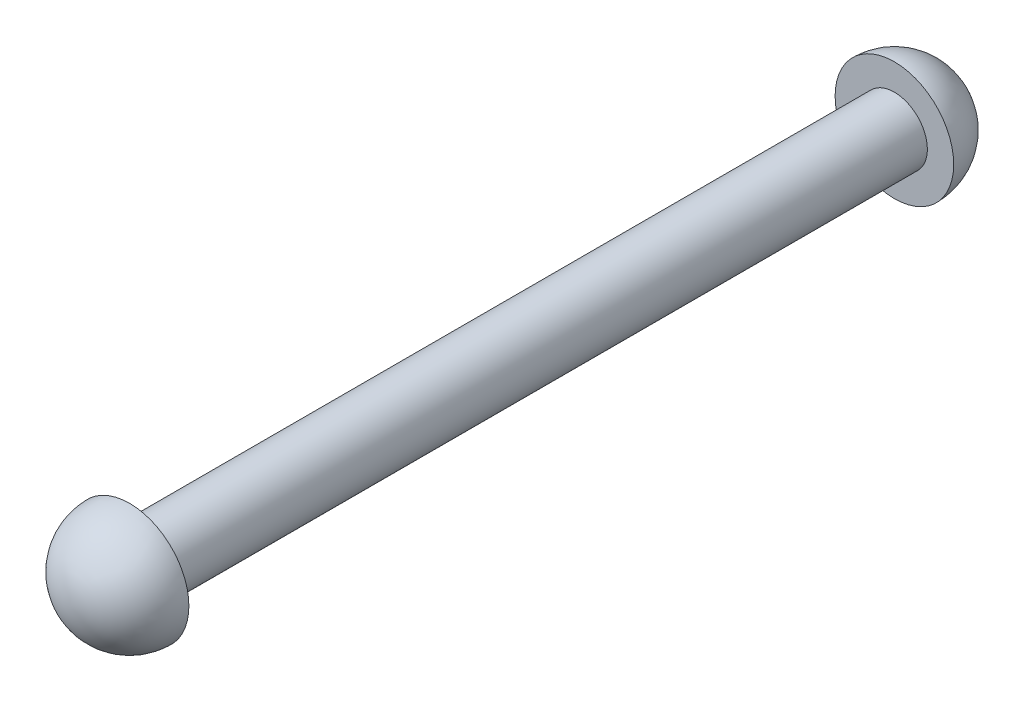
ISO-10303-21;
HEADER;
FILE_DESCRIPTION(('STEP AP214'),'2;1');
FILE_NAME('part.step','',(''),(''),'','','');
FILE_SCHEMA(('AUTOMOTIVE_DESIGN { 1 0 10303 214 1 1 1 1 }'));
ENDSEC;
DATA;
#1=APPLICATION_CONTEXT('core data for automotive mechanical design processes');
#2=APPLICATION_PROTOCOL_DEFINITION('international standard','automotive_design',2000,#1);
#3=PRODUCT_CONTEXT('',#1,'mechanical');
#4=PRODUCT('Part','Part','',(#3));
#5=PRODUCT_RELATED_PRODUCT_CATEGORY('part','',(#4));
#6=PRODUCT_DEFINITION_FORMATION('','',#4);
#7=PRODUCT_DEFINITION_CONTEXT('part definition',#1,'design');
#8=PRODUCT_DEFINITION('design','',#6,#7);
#9=PRODUCT_DEFINITION_SHAPE('','',#8);
#10=(LENGTH_UNIT() NAMED_UNIT(*) SI_UNIT(.MILLI.,.METRE.));
#11=(NAMED_UNIT(*) PLANE_ANGLE_UNIT() SI_UNIT($,.RADIAN.));
#12=(NAMED_UNIT(*) SI_UNIT($,.STERADIAN.) SOLID_ANGLE_UNIT());
#13=UNCERTAINTY_MEASURE_WITH_UNIT(LENGTH_MEASURE(1.E-05),#10,'distance_accuracy_value','');
#14=(GEOMETRIC_REPRESENTATION_CONTEXT(3) GLOBAL_UNCERTAINTY_ASSIGNED_CONTEXT((#13)) GLOBAL_UNIT_ASSIGNED_CONTEXT((#10,
#11,#12)) REPRESENTATION_CONTEXT('',''));
#15=CARTESIAN_POINT('',(0.,0.,0.));
#16=DIRECTION('',(0.,0.,1.));
#17=DIRECTION('',(1.,0.,0.));
#18=AXIS2_PLACEMENT_3D('',#15,#16,#17);
#19=CARTESIAN_POINT('',(0.,0.,39.6060392487021));
#20=DIRECTION('',(0.,0.,1.));
#21=DIRECTION('',(0.,-1.,0.));
#22=AXIS2_PLACEMENT_3D('',#19,#20,#21);
#23=CYLINDRICAL_SURFACE('',#22,2.95603448275862);
#24=CARTESIAN_POINT('',(0.,0.,-34.29));
#25=DIRECTION('',(0.,0.,1.));
#26=DIRECTION('',(0.,-1.,0.));
#27=AXIS2_PLACEMENT_3D('',#24,#25,#26);
#28=CIRCLE('',#27,2.95603448275862);
#29=CARTESIAN_POINT('',(0.,-2.95603448275862,-34.29));
#30=VERTEX_POINT('',#29);
#31=EDGE_CURVE('E62',#30,#30,#28,.T.);
#32=ORIENTED_EDGE('',*,*,#31,.T.);
#33=EDGE_LOOP('',(#32));
#34=FACE_BOUND('',#33,.T.);
#35=CARTESIAN_POINT('',(0.,0.,34.29));
#36=DIRECTION('',(0.,0.,1.));
#37=DIRECTION('',(0.,-1.,0.));
#38=AXIS2_PLACEMENT_3D('',#35,#36,#37);
#39=CIRCLE('',#38,2.95603448275862);
#40=CARTESIAN_POINT('',(0.,-2.95603448275862,34.29));
#41=VERTEX_POINT('',#40);
#42=EDGE_CURVE('E10',#41,#41,#39,.T.);
#43=ORIENTED_EDGE('',*,*,#42,.F.);
#44=EDGE_LOOP('',(#43));
#45=FACE_BOUND('',#44,.T.);
#46=ADVANCED_FACE('F45',(#34,#45),#23,.T.);
#47=CARTESIAN_POINT('',(0.,0.,34.29));
#48=DIRECTION('',(0.,0.,1.));
#49=DIRECTION('',(0.,-1.,0.));
#50=AXIS2_PLACEMENT_3D('',#47,#48,#49);
#51=PLANE('',#50);
#52=CARTESIAN_POINT('',(0.,0.,34.29));
#53=DIRECTION('',(0.,0.,1.));
#54=DIRECTION('',(0.,-1.,0.));
#55=AXIS2_PLACEMENT_3D('',#52,#53,#54);
#56=CIRCLE('',#55,5.31603924870214);
#57=CARTESIAN_POINT('',(0.,-5.31603924870214,34.29));
#58=VERTEX_POINT('',#57);
#59=EDGE_CURVE('E52',#58,#58,#56,.T.);
#60=ORIENTED_EDGE('',*,*,#59,.F.);
#61=EDGE_LOOP('',(#60));
#62=FACE_BOUND('',#61,.T.);
#63=ORIENTED_EDGE('',*,*,#42,.T.);
#64=EDGE_LOOP('',(#63));
#65=FACE_BOUND('',#64,.T.);
#66=ADVANCED_FACE('F83',(#62,#65),#51,.F.);
#67=CARTESIAN_POINT('',(0.,0.,34.29));
#68=DIRECTION('',(0.,0.,1.));
#69=DIRECTION('',(0.,1.,0.));
#70=AXIS2_PLACEMENT_3D('',#67,#68,#69);
#71=SPHERICAL_SURFACE('',#70,5.31603924870214);
#72=ORIENTED_EDGE('',*,*,#59,.T.);
#73=EDGE_LOOP('',(#72));
#74=FACE_BOUND('',#73,.T.);
#75=ADVANCED_FACE('F79',(#74),#71,.T.);
#76=CARTESIAN_POINT('',(0.,0.,-34.29));
#77=DIRECTION('',(0.,0.,1.));
#78=DIRECTION('',(0.,1.,0.));
#79=AXIS2_PLACEMENT_3D('',#76,#77,#78);
#80=SPHERICAL_SURFACE('',#79,5.31603924870214);
#81=CARTESIAN_POINT('',(0.,0.,-34.29));
#82=DIRECTION('',(0.,0.,1.));
#83=DIRECTION('',(0.,-1.,0.));
#84=AXIS2_PLACEMENT_3D('',#81,#82,#83);
#85=CIRCLE('',#84,5.31603924870214);
#86=CARTESIAN_POINT('',(0.,-5.31603924870215,-34.29));
#87=VERTEX_POINT('',#86);
#88=EDGE_CURVE('E57',#87,#87,#85,.T.);
#89=ORIENTED_EDGE('',*,*,#88,.F.);
#90=EDGE_LOOP('',(#89));
#91=FACE_BOUND('',#90,.T.);
#92=ADVANCED_FACE('F73',(#91),#80,.T.);
#93=CARTESIAN_POINT('',(0.,0.,-34.29));
#94=DIRECTION('',(0.,0.,1.));
#95=DIRECTION('',(0.,-1.,0.));
#96=AXIS2_PLACEMENT_3D('',#93,#94,#95);
#97=PLANE('',#96);
#98=ORIENTED_EDGE('',*,*,#88,.T.);
#99=EDGE_LOOP('',(#98));
#100=FACE_BOUND('',#99,.T.);
#101=ORIENTED_EDGE('',*,*,#31,.F.);
#102=EDGE_LOOP('',(#101));
#103=FACE_BOUND('',#102,.T.);
#104=ADVANCED_FACE('F71',(#100,#103),#97,.T.);
#105=CLOSED_SHELL('',(#46,#66,#75,#92,#104));
#106=MANIFOLD_SOLID_BREP('B2',#105);
#107=ADVANCED_BREP_SHAPE_REPRESENTATION('',(#18,#106),#14);
#108=SHAPE_DEFINITION_REPRESENTATION(#9,#107);
ENDSEC;
END-ISO-10303-21;
